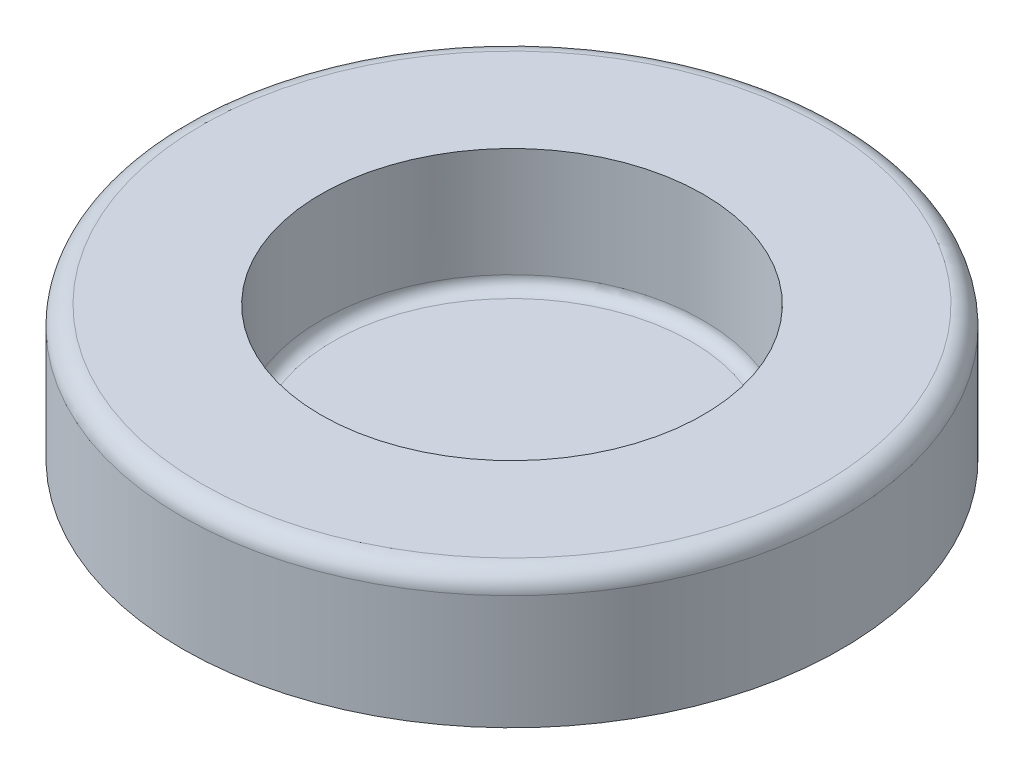
ISO-10303-21;
HEADER;
FILE_DESCRIPTION(('STEP AP214'),'2;1');
FILE_NAME('part.step','',(''),(''),'','','');
FILE_SCHEMA(('AUTOMOTIVE_DESIGN { 1 0 10303 214 1 1 1 1 }'));
ENDSEC;
DATA;
#1=APPLICATION_CONTEXT('core data for automotive mechanical design processes');
#2=APPLICATION_PROTOCOL_DEFINITION('international standard','automotive_design',2000,#1);
#3=PRODUCT_CONTEXT('',#1,'mechanical');
#4=PRODUCT('Part','Part','',(#3));
#5=PRODUCT_RELATED_PRODUCT_CATEGORY('part','',(#4));
#6=PRODUCT_DEFINITION_FORMATION('','',#4);
#7=PRODUCT_DEFINITION_CONTEXT('part definition',#1,'design');
#8=PRODUCT_DEFINITION('design','',#6,#7);
#9=PRODUCT_DEFINITION_SHAPE('','',#8);
#10=(LENGTH_UNIT() NAMED_UNIT(*) SI_UNIT(.MILLI.,.METRE.));
#11=(NAMED_UNIT(*) PLANE_ANGLE_UNIT() SI_UNIT($,.RADIAN.));
#12=(NAMED_UNIT(*) SI_UNIT($,.STERADIAN.) SOLID_ANGLE_UNIT());
#13=UNCERTAINTY_MEASURE_WITH_UNIT(LENGTH_MEASURE(1.E-05),#10,'distance_accuracy_value','');
#14=(GEOMETRIC_REPRESENTATION_CONTEXT(3) GLOBAL_UNCERTAINTY_ASSIGNED_CONTEXT((#13)) GLOBAL_UNIT_ASSIGNED_CONTEXT((#10,
#11,#12)) REPRESENTATION_CONTEXT('',''));
#15=CARTESIAN_POINT('',(0.,0.,0.));
#16=DIRECTION('',(0.,0.,1.));
#17=DIRECTION('',(1.,0.,0.));
#18=AXIS2_PLACEMENT_3D('',#15,#16,#17);
#19=CARTESIAN_POINT('',(0.,2.794,0.));
#20=DIRECTION('',(0.,-1.,0.));
#21=DIRECTION('',(0.,0.,-1.));
#22=AXIS2_PLACEMENT_3D('',#19,#20,#21);
#23=CYLINDRICAL_SURFACE('',#22,4.0005);
#24=CARTESIAN_POINT('',(0.,0.508,0.));
#25=DIRECTION('',(0.,-1.,0.));
#26=DIRECTION('',(0.,0.,-1.));
#27=AXIS2_PLACEMENT_3D('',#24,#25,#26);
#28=CIRCLE('',#27,4.0005);
#29=CARTESIAN_POINT('',(0.,0.508,-4.0005));
#30=VERTEX_POINT('',#29);
#31=EDGE_CURVE('E46',#30,#30,#28,.T.);
#32=ORIENTED_EDGE('',*,*,#31,.T.);
#33=EDGE_LOOP('',(#32));
#34=FACE_BOUND('',#33,.T.);
#35=CARTESIAN_POINT('',(0.,2.794,0.));
#36=DIRECTION('',(0.,1.,0.));
#37=DIRECTION('',(0.,0.,1.));
#38=AXIS2_PLACEMENT_3D('',#35,#36,#37);
#39=CIRCLE('',#38,4.0005);
#40=CARTESIAN_POINT('',(0.,2.794,4.0005));
#41=VERTEX_POINT('',#40);
#42=EDGE_CURVE('E54',#41,#41,#39,.T.);
#43=ORIENTED_EDGE('',*,*,#42,.T.);
#44=EDGE_LOOP('',(#43));
#45=FACE_BOUND('',#44,.T.);
#46=ADVANCED_FACE('F31',(#34,#45),#23,.F.);
#47=CARTESIAN_POINT('',(0.,2.794,0.));
#48=DIRECTION('',(0.,1.,0.));
#49=DIRECTION('',(0.,0.,1.));
#50=AXIS2_PLACEMENT_3D('',#47,#48,#49);
#51=PLANE('',#50);
#52=CARTESIAN_POINT('',(0.,2.794,0.));
#53=DIRECTION('',(0.,1.,0.));
#54=DIRECTION('',(0.,0.,1.));
#55=AXIS2_PLACEMENT_3D('',#52,#53,#54);
#56=CIRCLE('',#55,6.4961);
#57=CARTESIAN_POINT('',(0.,2.794,6.4961));
#58=VERTEX_POINT('',#57);
#59=EDGE_CURVE('E38',#58,#58,#56,.T.);
#60=ORIENTED_EDGE('',*,*,#59,.T.);
#61=EDGE_LOOP('',(#60));
#62=FACE_BOUND('',#61,.T.);
#63=ORIENTED_EDGE('',*,*,#42,.F.);
#64=EDGE_LOOP('',(#63));
#65=FACE_BOUND('',#64,.T.);
#66=ADVANCED_FACE('F59',(#62,#65),#51,.T.);
#67=CARTESIAN_POINT('',(0.,0.,0.));
#68=DIRECTION('',(0.,1.,0.));
#69=DIRECTION('',(0.,0.,1.));
#70=AXIS2_PLACEMENT_3D('',#67,#68,#69);
#71=PLANE('',#70);
#72=CARTESIAN_POINT('',(0.,0.,0.));
#73=DIRECTION('',(0.,1.,0.));
#74=DIRECTION('',(0.,0.,1.));
#75=AXIS2_PLACEMENT_3D('',#72,#73,#74);
#76=CIRCLE('',#75,6.8961);
#77=CARTESIAN_POINT('',(0.,0.,6.8961));
#78=VERTEX_POINT('',#77);
#79=EDGE_CURVE('E51',#78,#78,#76,.T.);
#80=ORIENTED_EDGE('',*,*,#79,.F.);
#81=EDGE_LOOP('',(#80));
#82=FACE_BOUND('',#81,.T.);
#83=ADVANCED_FACE('F61',(#82),#71,.F.);
#84=CARTESIAN_POINT('',(0.,2.794,0.));
#85=DIRECTION('',(0.,-1.,0.));
#86=DIRECTION('',(0.,0.,-1.));
#87=AXIS2_PLACEMENT_3D('',#84,#85,#86);
#88=CYLINDRICAL_SURFACE('',#87,6.8961);
#89=CARTESIAN_POINT('',(0.,2.394,0.));
#90=DIRECTION('',(0.,1.,0.));
#91=DIRECTION('',(0.,0.,1.));
#92=AXIS2_PLACEMENT_3D('',#89,#90,#91);
#93=CIRCLE('',#92,6.8961);
#94=CARTESIAN_POINT('',(0.,2.394,6.8961));
#95=VERTEX_POINT('',#94);
#96=EDGE_CURVE('E10',#95,#95,#93,.F.);
#97=ORIENTED_EDGE('',*,*,#96,.T.);
#98=EDGE_LOOP('',(#97));
#99=FACE_BOUND('',#98,.T.);
#100=ORIENTED_EDGE('',*,*,#79,.T.);
#101=EDGE_LOOP('',(#100));
#102=FACE_BOUND('',#101,.T.);
#103=ADVANCED_FACE('F67',(#99,#102),#88,.T.);
#104=CARTESIAN_POINT('',(0.,0.254,0.));
#105=DIRECTION('',(0.,-1.,0.));
#106=DIRECTION('',(0.,0.,-1.));
#107=AXIS2_PLACEMENT_3D('',#104,#105,#106);
#108=PLANE('',#107);
#109=CARTESIAN_POINT('',(0.,0.254,0.));
#110=DIRECTION('',(0.,-1.,0.));
#111=DIRECTION('',(0.,0.,-1.));
#112=AXIS2_PLACEMENT_3D('',#109,#110,#111);
#113=CIRCLE('',#112,3.7465);
#114=CARTESIAN_POINT('',(0.,0.254,-3.7465));
#115=VERTEX_POINT('',#114);
#116=EDGE_CURVE('E42',#115,#115,#113,.F.);
#117=ORIENTED_EDGE('',*,*,#116,.T.);
#118=EDGE_LOOP('',(#117));
#119=FACE_BOUND('',#118,.T.);
#120=ADVANCED_FACE('F75',(#119),#108,.F.);
#121=CARTESIAN_POINT('',(0.,0.508,0.));
#122=DIRECTION('',(0.,-1.,0.));
#123=DIRECTION('',(0.,0.,-1.));
#124=AXIS2_PLACEMENT_3D('',#121,#122,#123);
#125=TOROIDAL_SURFACE('',#124,3.7465,0.254);
#126=ORIENTED_EDGE('',*,*,#116,.F.);
#127=EDGE_LOOP('',(#126));
#128=FACE_BOUND('',#127,.T.);
#129=ORIENTED_EDGE('',*,*,#31,.F.);
#130=EDGE_LOOP('',(#129));
#131=FACE_BOUND('',#130,.T.);
#132=ADVANCED_FACE('F76',(#128,#131),#125,.F.);
#133=CARTESIAN_POINT('',(0.,2.394,0.));
#134=DIRECTION('',(0.,1.,0.));
#135=DIRECTION('',(0.,0.,1.));
#136=AXIS2_PLACEMENT_3D('',#133,#134,#135);
#137=TOROIDAL_SURFACE('',#136,6.4961,0.4);
#138=ORIENTED_EDGE('',*,*,#96,.F.);
#139=EDGE_LOOP('',(#138));
#140=FACE_BOUND('',#139,.T.);
#141=ORIENTED_EDGE('',*,*,#59,.F.);
#142=EDGE_LOOP('',(#141));
#143=FACE_BOUND('',#142,.T.);
#144=ADVANCED_FACE('F33',(#140,#143),#137,.T.);
#145=CLOSED_SHELL('',(#46,#66,#83,#103,#120,#132,#144));
#146=MANIFOLD_SOLID_BREP('B2',#145);
#147=ADVANCED_BREP_SHAPE_REPRESENTATION('',(#18,#146),#14);
#148=SHAPE_DEFINITION_REPRESENTATION(#9,#147);
ENDSEC;
END-ISO-10303-21;
